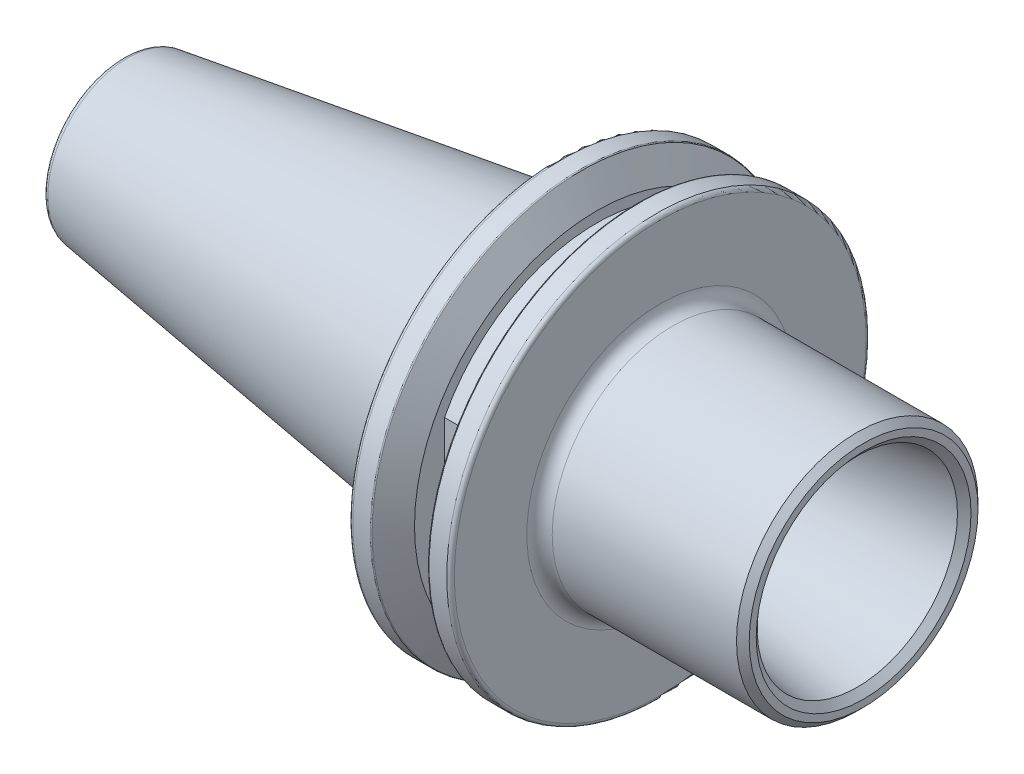
ISO-10303-21;
HEADER;
FILE_DESCRIPTION(('STEP AP214'),'2;1');
FILE_NAME('part.step','',(''),(''),'','','');
FILE_SCHEMA(('AUTOMOTIVE_DESIGN { 1 0 10303 214 1 1 1 1 }'));
ENDSEC;
DATA;
#1=APPLICATION_CONTEXT('core data for automotive mechanical design processes');
#2=APPLICATION_PROTOCOL_DEFINITION('international standard','automotive_design',2000,#1);
#3=PRODUCT_CONTEXT('',#1,'mechanical');
#4=PRODUCT('Part','Part','',(#3));
#5=PRODUCT_RELATED_PRODUCT_CATEGORY('part','',(#4));
#6=PRODUCT_DEFINITION_FORMATION('','',#4);
#7=PRODUCT_DEFINITION_CONTEXT('part definition',#1,'design');
#8=PRODUCT_DEFINITION('design','',#6,#7);
#9=PRODUCT_DEFINITION_SHAPE('','',#8);
#10=(LENGTH_UNIT() NAMED_UNIT(*) SI_UNIT(.MILLI.,.METRE.));
#11=(NAMED_UNIT(*) PLANE_ANGLE_UNIT() SI_UNIT($,.RADIAN.));
#12=(NAMED_UNIT(*) SI_UNIT($,.STERADIAN.) SOLID_ANGLE_UNIT());
#13=UNCERTAINTY_MEASURE_WITH_UNIT(LENGTH_MEASURE(1.E-05),#10,'distance_accuracy_value','');
#14=(GEOMETRIC_REPRESENTATION_CONTEXT(3) GLOBAL_UNCERTAINTY_ASSIGNED_CONTEXT((#13)) GLOBAL_UNIT_ASSIGNED_CONTEXT((#10,
#11,#12)) REPRESENTATION_CONTEXT('',''));
#15=CARTESIAN_POINT('',(0.,0.,0.));
#16=DIRECTION('',(0.,0.,1.));
#17=DIRECTION('',(1.,0.,0.));
#18=AXIS2_PLACEMENT_3D('',#15,#16,#17);
#19=CARTESIAN_POINT('',(-16.3,0.,0.));
#20=DIRECTION('',(1.,0.,0.));
#21=DIRECTION('',(0.,0.,-1.));
#22=AXIS2_PLACEMENT_3D('',#19,#20,#21);
#23=TOROIDAL_SURFACE('',#22,16.2,0.299999999999999);
#24=CARTESIAN_POINT('',(-16.,0.,0.));
#25=DIRECTION('',(-1.,0.,0.));
#26=DIRECTION('',(0.,1.,0.));
#27=AXIS2_PLACEMENT_3D('',#24,#25,#26);
#28=CIRCLE('',#27,16.2);
#29=CARTESIAN_POINT('',(-16.,16.2,0.));
#30=VERTEX_POINT('',#29);
#31=EDGE_CURVE('E131',#30,#30,#28,.F.);
#32=ORIENTED_EDGE('',*,*,#31,.F.);
#33=EDGE_LOOP('',(#32));
#34=FACE_BOUND('',#33,.T.);
#35=CARTESIAN_POINT('',(-16.3,0.,0.));
#36=DIRECTION('',(1.,0.,0.));
#37=DIRECTION('',(0.,0.,-1.));
#38=AXIS2_PLACEMENT_3D('',#35,#36,#37);
#39=CIRCLE('',#38,16.5);
#40=CARTESIAN_POINT('',(-16.3,0.,-16.5));
#41=VERTEX_POINT('',#40);
#42=EDGE_CURVE('E127',#41,#41,#39,.F.);
#43=ORIENTED_EDGE('',*,*,#42,.F.);
#44=EDGE_LOOP('',(#43));
#45=FACE_BOUND('',#44,.T.);
#46=ADVANCED_FACE('F17',(#34,#45),#23,.T.);
#47=CARTESIAN_POINT('',(-16.,10.5,0.));
#48=DIRECTION('',(1.,0.,0.));
#49=DIRECTION('',(0.,0.,-1.));
#50=AXIS2_PLACEMENT_3D('',#47,#48,#49);
#51=PLANE('',#50);
#52=CARTESIAN_POINT('',(-16.,0.,0.));
#53=DIRECTION('',(1.,0.,0.));
#54=DIRECTION('',(0.,1.,0.));
#55=AXIS2_PLACEMENT_3D('',#52,#53,#54);
#56=CIRCLE('',#55,10.5);
#57=CARTESIAN_POINT('',(-16.,10.5,0.));
#58=VERTEX_POINT('',#57);
#59=EDGE_CURVE('E130',#58,#58,#56,.F.);
#60=ORIENTED_EDGE('',*,*,#59,.T.);
#61=EDGE_LOOP('',(#60));
#62=FACE_BOUND('',#61,.T.);
#63=ORIENTED_EDGE('',*,*,#31,.T.);
#64=EDGE_LOOP('',(#63));
#65=FACE_BOUND('',#64,.T.);
#66=ADVANCED_FACE('F143',(#62,#65),#51,.T.);
#67=CARTESIAN_POINT('',(-16.9961324865405,0.,0.));
#68=DIRECTION('',(1.,0.,0.));
#69=DIRECTION('',(0.,0.,-1.));
#70=AXIS2_PLACEMENT_3D('',#67,#68,#69);
#71=CYLINDRICAL_SURFACE('',#70,16.5);
#72=ORIENTED_EDGE('',*,*,#42,.T.);
#73=EDGE_LOOP('',(#72));
#74=FACE_BOUND('',#73,.T.);
#75=CARTESIAN_POINT('',(-17.692264973081,0.,0.));
#76=DIRECTION('',(1.,0.,0.));
#77=DIRECTION('',(0.,0.,-1.));
#78=AXIS2_PLACEMENT_3D('',#75,#76,#77);
#79=CIRCLE('',#78,16.5);
#80=CARTESIAN_POINT('',(-17.692264973081,0.,-16.5));
#81=VERTEX_POINT('',#80);
#82=EDGE_CURVE('E102',#81,#81,#79,.F.);
#83=ORIENTED_EDGE('',*,*,#82,.F.);
#84=EDGE_LOOP('',(#83));
#85=FACE_BOUND('',#84,.T.);
#86=ADVANCED_FACE('F121',(#74,#85),#71,.T.);
#87=CARTESIAN_POINT('',(-15.,0.,0.));
#88=DIRECTION('',(1.,0.,0.));
#89=DIRECTION('',(0.,0.,-1.));
#90=AXIS2_PLACEMENT_3D('',#87,#88,#89);
#91=TOROIDAL_SURFACE('',#90,10.5,1.);
#92=CARTESIAN_POINT('',(-15.,0.,0.));
#93=DIRECTION('',(1.,0.,0.));
#94=DIRECTION('',(0.,0.,-1.));
#95=AXIS2_PLACEMENT_3D('',#92,#93,#94);
#96=CIRCLE('',#95,9.5);
#97=CARTESIAN_POINT('',(-15.,0.,-9.5));
#98=VERTEX_POINT('',#97);
#99=EDGE_CURVE('E97',#98,#98,#96,.T.);
#100=ORIENTED_EDGE('',*,*,#99,.F.);
#101=EDGE_LOOP('',(#100));
#102=FACE_BOUND('',#101,.T.);
#103=ORIENTED_EDGE('',*,*,#59,.F.);
#104=EDGE_LOOP('',(#103));
#105=FACE_BOUND('',#104,.T.);
#106=ADVANCED_FACE('F114',(#102,#105),#91,.F.);
#107=CARTESIAN_POINT('',(-17.692264973081,0.,0.));
#108=DIRECTION('',(1.,0.,0.));
#109=DIRECTION('',(0.,0.,-1.));
#110=AXIS2_PLACEMENT_3D('',#107,#108,#109);
#111=TOROIDAL_SURFACE('',#110,16.4,0.1);
#112=ORIENTED_EDGE('',*,*,#82,.T.);
#113=EDGE_LOOP('',(#112));
#114=FACE_BOUND('',#113,.T.);
#115=CARTESIAN_POINT('',(-17.7788675134631,0.,0.));
#116=DIRECTION('',(1.,0.,0.));
#117=DIRECTION('',(0.,1.,0.));
#118=AXIS2_PLACEMENT_3D('',#115,#116,#117);
#119=CIRCLE('',#118,16.4500000000021);
#120=CARTESIAN_POINT('',(-17.7788675134631,16.4500000000021,0.));
#121=VERTEX_POINT('',#120);
#122=EDGE_CURVE('E92',#121,#121,#119,.F.);
#123=ORIENTED_EDGE('',*,*,#122,.F.);
#124=EDGE_LOOP('',(#123));
#125=FACE_BOUND('',#124,.T.);
#126=ADVANCED_FACE('F109',(#114,#125),#111,.T.);
#127=CARTESIAN_POINT('',(-7.75,0.,0.));
#128=DIRECTION('',(1.,0.,0.));
#129=DIRECTION('',(0.,0.,-1.));
#130=AXIS2_PLACEMENT_3D('',#127,#128,#129);
#131=CYLINDRICAL_SURFACE('',#130,9.5);
#132=CARTESIAN_POINT('',(-0.499999999999362,0.,0.));
#133=DIRECTION('',(-1.,0.,0.));
#134=DIRECTION('',(0.,1.,0.));
#135=AXIS2_PLACEMENT_3D('',#132,#133,#134);
#136=CIRCLE('',#135,9.50000000000064);
#137=CARTESIAN_POINT('',(-0.499999999999361,9.50000000000064,0.));
#138=VERTEX_POINT('',#137);
#139=EDGE_CURVE('E88',#138,#138,#136,.F.);
#140=ORIENTED_EDGE('',*,*,#139,.F.);
#141=EDGE_LOOP('',(#140));
#142=FACE_BOUND('',#141,.T.);
#143=ORIENTED_EDGE('',*,*,#99,.T.);
#144=EDGE_LOOP('',(#143));
#145=FACE_BOUND('',#144,.T.);
#146=ADVANCED_FACE('F113',(#142,#145),#131,.T.);
#147=CARTESIAN_POINT('',(-17.7788675134631,0.,0.));
#148=DIRECTION('',(1.,0.,0.));
#149=DIRECTION('',(0.,0.,-1.));
#150=AXIS2_PLACEMENT_3D('',#147,#148,#149);
#151=CONICAL_SURFACE('',#150,16.4500000000021,1.0471975512);
#152=ORIENTED_EDGE('',*,*,#122,.T.);
#153=EDGE_LOOP('',(#152));
#154=FACE_BOUND('',#153,.T.);
#155=CARTESIAN_POINT('',(-18.9999999999964,0.,0.));
#156=DIRECTION('',(1.,0.,0.));
#157=DIRECTION('',(0.,0.,-1.));
#158=AXIS2_PLACEMENT_3D('',#155,#156,#157);
#159=CIRCLE('',#158,14.3349364905368);
#160=CARTESIAN_POINT('',(-18.9999999999964,0.,-14.3349364905368));
#161=VERTEX_POINT('',#160);
#162=EDGE_CURVE('E91',#161,#161,#159,.F.);
#163=ORIENTED_EDGE('',*,*,#162,.F.);
#164=EDGE_LOOP('',(#163));
#165=FACE_BOUND('',#164,.T.);
#166=ADVANCED_FACE('F229',(#154,#165),#151,.T.);
#167=CARTESIAN_POINT('',(-0.499999999999361,0.,0.));
#168=DIRECTION('',(-1.,0.,0.));
#169=DIRECTION('',(0.,0.,1.));
#170=AXIS2_PLACEMENT_3D('',#167,#168,#169);
#171=CONICAL_SURFACE('',#170,9.50000000000064,0.785398163400002);
#172=CARTESIAN_POINT('',(-6.39028760462956E-13,0.,0.));
#173=DIRECTION('',(-1.,0.,0.));
#174=DIRECTION('',(0.,0.,1.));
#175=AXIS2_PLACEMENT_3D('',#172,#173,#174);
#176=CIRCLE('',#175,8.99999999999936);
#177=CARTESIAN_POINT('',(-6.39028760462956E-13,0.,8.99999999999936));
#178=VERTEX_POINT('',#177);
#179=EDGE_CURVE('E68',#178,#178,#176,.F.);
#180=ORIENTED_EDGE('',*,*,#179,.F.);
#181=EDGE_LOOP('',(#180));
#182=FACE_BOUND('',#181,.T.);
#183=ORIENTED_EDGE('',*,*,#139,.T.);
#184=EDGE_LOOP('',(#183));
#185=FACE_BOUND('',#184,.T.);
#186=ADVANCED_FACE('F231',(#182,#185),#171,.T.);
#187=CARTESIAN_POINT('',(-19.,14.3349364905389,0.));
#188=DIRECTION('',(-1.,0.,0.));
#189=DIRECTION('',(0.,0.,1.));
#190=AXIS2_PLACEMENT_3D('',#187,#188,#189);
#191=PLANE('',#190);
#192=CARTESIAN_POINT('',(-19.,0.,0.));
#193=DIRECTION('',(1.,0.,0.));
#194=DIRECTION('',(0.,0.,-1.));
#195=AXIS2_PLACEMENT_3D('',#192,#193,#194);
#196=CIRCLE('',#195,13.5);
#197=CARTESIAN_POINT('',(-19.,6.23292668013992,11.975));
#198=VERTEX_POINT('',#197);
#199=CARTESIAN_POINT('',(-19.,6.23292668013992,-11.975));
#200=VERTEX_POINT('',#199);
#201=EDGE_CURVE('E58',#198,#200,#196,.F.);
#202=ORIENTED_EDGE('',*,*,#201,.F.);
#203=DIRECTION('',(0.,1.,0.));
#204=VECTOR('',#203,1.);
#205=CARTESIAN_POINT('',(-19.,-16.5,11.975));
#206=LINE('',#205,#204);
#207=CARTESIAN_POINT('',(-19.,-6.23292668013992,11.975));
#208=VERTEX_POINT('',#207);
#209=EDGE_CURVE('E64',#198,#208,#206,.F.);
#210=ORIENTED_EDGE('',*,*,#209,.T.);
#211=CARTESIAN_POINT('',(-19.,0.,0.));
#212=DIRECTION('',(1.,0.,0.));
#213=DIRECTION('',(0.,0.,-1.));
#214=AXIS2_PLACEMENT_3D('',#211,#212,#213);
#215=CIRCLE('',#214,13.5);
#216=CARTESIAN_POINT('',(-19.,-6.23292668013992,-11.975));
#217=VERTEX_POINT('',#216);
#218=EDGE_CURVE('E77',#217,#208,#215,.F.);
#219=ORIENTED_EDGE('',*,*,#218,.F.);
#220=DIRECTION('',(0.,1.,0.));
#221=VECTOR('',#220,1.);
#222=CARTESIAN_POINT('',(-19.,-16.5,-11.975));
#223=LINE('',#222,#221);
#224=EDGE_CURVE('E65',#217,#200,#223,.T.);
#225=ORIENTED_EDGE('',*,*,#224,.T.);
#226=EDGE_LOOP('',(#202,#210,#219,#225));
#227=FACE_BOUND('',#226,.T.);
#228=ORIENTED_EDGE('',*,*,#162,.T.);
#229=EDGE_LOOP('',(#228));
#230=FACE_BOUND('',#229,.T.);
#231=ADVANCED_FACE('F60',(#227,#230),#191,.T.);
#232=CARTESIAN_POINT('',(0.,8.45,0.));
#233=DIRECTION('',(1.,0.,0.));
#234=DIRECTION('',(0.,0.,-1.));
#235=AXIS2_PLACEMENT_3D('',#232,#233,#234);
#236=PLANE('',#235);
#237=CARTESIAN_POINT('',(-7.90112333198811E-13,0.,0.));
#238=DIRECTION('',(1.,0.,0.));
#239=DIRECTION('',(0.,0.,-1.));
#240=AXIS2_PLACEMENT_3D('',#237,#238,#239);
#241=CIRCLE('',#240,8.45000000000069);
#242=CARTESIAN_POINT('',(-7.90112333198811E-13,0.,-8.45000000000069));
#243=VERTEX_POINT('',#242);
#244=EDGE_CURVE('E81',#243,#243,#241,.F.);
#245=ORIENTED_EDGE('',*,*,#244,.T.);
#246=EDGE_LOOP('',(#245));
#247=FACE_BOUND('',#246,.T.);
#248=ORIENTED_EDGE('',*,*,#179,.T.);
#249=EDGE_LOOP('',(#248));
#250=FACE_BOUND('',#249,.T.);
#251=ADVANCED_FACE('F427',(#247,#250),#236,.T.);
#252=CARTESIAN_POINT('',(-20.,0.,0.));
#253=DIRECTION('',(1.,0.,0.));
#254=DIRECTION('',(0.,0.,-1.));
#255=AXIS2_PLACEMENT_3D('',#252,#253,#254);
#256=CYLINDRICAL_SURFACE('',#255,13.5);
#257=DIRECTION('',(1.,0.,0.));
#258=VECTOR('',#257,1.);
#259=CARTESIAN_POINT('',(-21.,6.23292668013992,-11.975));
#260=LINE('',#259,#258);
#261=CARTESIAN_POINT('',(-21.,6.23292668013992,-11.975));
#262=VERTEX_POINT('',#261);
#263=EDGE_CURVE('E85',#200,#262,#260,.F.);
#264=ORIENTED_EDGE('',*,*,#263,.T.);
#265=CARTESIAN_POINT('',(-21.,0.,0.));
#266=DIRECTION('',(1.,0.,0.));
#267=DIRECTION('',(0.,0.,-1.));
#268=AXIS2_PLACEMENT_3D('',#265,#266,#267);
#269=CIRCLE('',#268,13.5);
#270=CARTESIAN_POINT('',(-21.,6.23292668013992,11.975));
#271=VERTEX_POINT('',#270);
#272=EDGE_CURVE('E74',#271,#262,#269,.F.);
#273=ORIENTED_EDGE('',*,*,#272,.F.);
#274=DIRECTION('',(-1.,0.,0.));
#275=VECTOR('',#274,1.);
#276=CARTESIAN_POINT('',(-19.,6.23292668013992,11.975));
#277=LINE('',#276,#275);
#278=EDGE_CURVE('E71',#271,#198,#277,.F.);
#279=ORIENTED_EDGE('',*,*,#278,.T.);
#280=ORIENTED_EDGE('',*,*,#201,.T.);
#281=EDGE_LOOP('',(#264,#273,#279,#280));
#282=FACE_BOUND('',#281,.T.);
#283=ADVANCED_FACE('F72',(#282),#256,.T.);
#284=CARTESIAN_POINT('',(-21.,-16.5,-11.975));
#285=DIRECTION('',(0.,0.,1.));
#286=DIRECTION('',(1.,0.,0.));
#287=AXIS2_PLACEMENT_3D('',#284,#285,#286);
#288=PLANE('',#287);
#289=DIRECTION('',(0.,1.,0.));
#290=VECTOR('',#289,1.);
#291=CARTESIAN_POINT('',(-21.,13.5,-11.975));
#292=LINE('',#291,#290);
#293=CARTESIAN_POINT('',(-21.,-6.23292668013992,-11.975));
#294=VERTEX_POINT('',#293);
#295=EDGE_CURVE('E215',#262,#294,#292,.F.);
#296=ORIENTED_EDGE('',*,*,#295,.F.);
#297=ORIENTED_EDGE('',*,*,#263,.F.);
#298=ORIENTED_EDGE('',*,*,#224,.F.);
#299=DIRECTION('',(1.,0.,0.));
#300=VECTOR('',#299,1.);
#301=CARTESIAN_POINT('',(-20.,-6.23292668013992,-11.975));
#302=LINE('',#301,#300);
#303=EDGE_CURVE('E221',#294,#217,#302,.T.);
#304=ORIENTED_EDGE('',*,*,#303,.F.);
#305=EDGE_LOOP('',(#296,#297,#298,#304));
#306=FACE_BOUND('',#305,.T.);
#307=ADVANCED_FACE('F421',(#306),#288,.F.);
#308=CARTESIAN_POINT('',(-20.,0.,0.));
#309=DIRECTION('',(1.,0.,0.));
#310=DIRECTION('',(0.,0.,-1.));
#311=AXIS2_PLACEMENT_3D('',#308,#309,#310);
#312=CYLINDRICAL_SURFACE('',#311,13.5);
#313=ORIENTED_EDGE('',*,*,#303,.T.);
#314=ORIENTED_EDGE('',*,*,#218,.T.);
#315=DIRECTION('',(-1.,0.,0.));
#316=VECTOR('',#315,1.);
#317=CARTESIAN_POINT('',(-19.,-6.23292668013992,11.975));
#318=LINE('',#317,#316);
#319=CARTESIAN_POINT('',(-21.,-6.23292668013992,11.975));
#320=VERTEX_POINT('',#319);
#321=EDGE_CURVE('E37',#208,#320,#318,.T.);
#322=ORIENTED_EDGE('',*,*,#321,.T.);
#323=CARTESIAN_POINT('',(-21.,0.,0.));
#324=DIRECTION('',(1.,0.,0.));
#325=DIRECTION('',(0.,0.,-1.));
#326=AXIS2_PLACEMENT_3D('',#323,#324,#325);
#327=CIRCLE('',#326,13.5);
#328=EDGE_CURVE('E211',#294,#320,#327,.F.);
#329=ORIENTED_EDGE('',*,*,#328,.F.);
#330=EDGE_LOOP('',(#313,#314,#322,#329));
#331=FACE_BOUND('',#330,.T.);
#332=ADVANCED_FACE('F418',(#331),#312,.T.);
#333=CARTESIAN_POINT('',(-19.,-16.5,11.975));
#334=DIRECTION('',(0.,0.,-1.));
#335=DIRECTION('',(-1.,0.,0.));
#336=AXIS2_PLACEMENT_3D('',#333,#334,#335);
#337=PLANE('',#336);
#338=ORIENTED_EDGE('',*,*,#209,.F.);
#339=ORIENTED_EDGE('',*,*,#278,.F.);
#340=DIRECTION('',(0.,1.,0.));
#341=VECTOR('',#340,1.);
#342=CARTESIAN_POINT('',(-21.,13.5,11.975));
#343=LINE('',#342,#341);
#344=EDGE_CURVE('E214',#320,#271,#343,.T.);
#345=ORIENTED_EDGE('',*,*,#344,.F.);
#346=ORIENTED_EDGE('',*,*,#321,.F.);
#347=EDGE_LOOP('',(#338,#339,#345,#346));
#348=FACE_BOUND('',#347,.T.);
#349=ADVANCED_FACE('F79',(#348),#337,.F.);
#350=CARTESIAN_POINT('',(-7.90112333198811E-13,0.,0.));
#351=DIRECTION('',(1.,0.,0.));
#352=DIRECTION('',(0.,0.,-1.));
#353=AXIS2_PLACEMENT_3D('',#350,#351,#352);
#354=CONICAL_SURFACE('',#353,8.45000000000069,0.855211333480002);
#355=CARTESIAN_POINT('',(-0.495134034395051,0.,0.));
#356=DIRECTION('',(1.,0.,0.));
#357=DIRECTION('',(0.,1.,0.));
#358=AXIS2_PLACEMENT_3D('',#355,#356,#357);
#359=CIRCLE('',#358,7.88041344952717);
#360=CARTESIAN_POINT('',(-0.495134034395051,7.88041344952717,0.));
#361=VERTEX_POINT('',#360);
#362=EDGE_CURVE('E208',#361,#361,#359,.F.);
#363=ORIENTED_EDGE('',*,*,#362,.T.);
#364=EDGE_LOOP('',(#363));
#365=FACE_BOUND('',#364,.T.);
#366=ORIENTED_EDGE('',*,*,#244,.F.);
#367=EDGE_LOOP('',(#366));
#368=FACE_BOUND('',#367,.T.);
#369=ADVANCED_FACE('F411',(#365,#368),#354,.F.);
#370=CARTESIAN_POINT('',(-21.,13.5,0.));
#371=DIRECTION('',(1.,0.,0.));
#372=DIRECTION('',(0.,0.,-1.));
#373=AXIS2_PLACEMENT_3D('',#370,#371,#372);
#374=PLANE('',#373);
#375=ORIENTED_EDGE('',*,*,#328,.T.);
#376=ORIENTED_EDGE('',*,*,#344,.T.);
#377=ORIENTED_EDGE('',*,*,#272,.T.);
#378=ORIENTED_EDGE('',*,*,#295,.T.);
#379=EDGE_LOOP('',(#375,#376,#377,#378));
#380=FACE_BOUND('',#379,.T.);
#381=CARTESIAN_POINT('',(-21.0000000000036,0.,0.));
#382=DIRECTION('',(-1.,0.,0.));
#383=DIRECTION('',(0.,0.,1.));
#384=AXIS2_PLACEMENT_3D('',#381,#382,#383);
#385=CIRCLE('',#384,14.3349364905368);
#386=CARTESIAN_POINT('',(-21.0000000000036,0.,14.3349364905368));
#387=VERTEX_POINT('',#386);
#388=EDGE_CURVE('E204',#387,#387,#385,.T.);
#389=ORIENTED_EDGE('',*,*,#388,.F.);
#390=EDGE_LOOP('',(#389));
#391=FACE_BOUND('',#390,.T.);
#392=ADVANCED_FACE('F407',(#380,#391),#374,.T.);
#393=CARTESIAN_POINT('',(-0.495134034565581,0.,0.));
#394=DIRECTION('',(1.,0.,0.));
#395=DIRECTION('',(0.,0.,-1.));
#396=AXIS2_PLACEMENT_3D('',#393,#394,#395);
#397=CONICAL_SURFACE('',#396,7.88041344949875,0.139626340159756);
#398=CARTESIAN_POINT('',(-14.0172783530969,0.,0.));
#399=DIRECTION('',(1.,0.,0.));
#400=DIRECTION('',(0.,0.,-1.));
#401=AXIS2_PLACEMENT_3D('',#398,#399,#400);
#402=CIRCLE('',#401,5.98);
#403=CARTESIAN_POINT('',(-14.0172783530969,0.,-5.98));
#404=VERTEX_POINT('',#403);
#405=EDGE_CURVE('E207',#404,#404,#402,.F.);
#406=ORIENTED_EDGE('',*,*,#405,.T.);
#407=EDGE_LOOP('',(#406));
#408=FACE_BOUND('',#407,.T.);
#409=ORIENTED_EDGE('',*,*,#362,.F.);
#410=EDGE_LOOP('',(#409));
#411=FACE_BOUND('',#410,.T.);
#412=ADVANCED_FACE('F403',(#408,#411),#397,.F.);
#413=CARTESIAN_POINT('',(-22.2211324865369,0.,0.));
#414=DIRECTION('',(-1.,0.,0.));
#415=DIRECTION('',(0.,0.,1.));
#416=AXIS2_PLACEMENT_3D('',#413,#414,#415);
#417=CONICAL_SURFACE('',#416,16.4500000000021,1.0471975512);
#418=ORIENTED_EDGE('',*,*,#388,.T.);
#419=EDGE_LOOP('',(#418));
#420=FACE_BOUND('',#419,.T.);
#421=CARTESIAN_POINT('',(-22.2211324865405,0.,0.));
#422=DIRECTION('',(1.,0.,0.));
#423=DIRECTION('',(0.,0.,-1.));
#424=AXIS2_PLACEMENT_3D('',#421,#422,#423);
#425=CIRCLE('',#424,16.45);
#426=CARTESIAN_POINT('',(-22.2211324865405,0.,-16.45));
#427=VERTEX_POINT('',#426);
#428=EDGE_CURVE('E201',#427,#427,#425,.F.);
#429=ORIENTED_EDGE('',*,*,#428,.F.);
#430=EDGE_LOOP('',(#429));
#431=FACE_BOUND('',#430,.T.);
#432=ADVANCED_FACE('F399',(#420,#431),#417,.T.);
#433=CARTESIAN_POINT('',(-21.2586391765484,0.,0.));
#434=DIRECTION('',(1.,0.,0.));
#435=DIRECTION('',(0.,0.,-1.));
#436=AXIS2_PLACEMENT_3D('',#433,#434,#435);
#437=CYLINDRICAL_SURFACE('',#436,5.98);
#438=CARTESIAN_POINT('',(-28.5,0.,0.));
#439=DIRECTION('',(1.,0.,0.));
#440=DIRECTION('',(0.,0.,-1.));
#441=AXIS2_PLACEMENT_3D('',#438,#439,#440);
#442=CIRCLE('',#441,5.98);
#443=CARTESIAN_POINT('',(-28.5,0.,-5.98));
#444=VERTEX_POINT('',#443);
#445=EDGE_CURVE('E198',#444,#444,#442,.T.);
#446=ORIENTED_EDGE('',*,*,#445,.F.);
#447=EDGE_LOOP('',(#446));
#448=FACE_BOUND('',#447,.T.);
#449=ORIENTED_EDGE('',*,*,#405,.F.);
#450=EDGE_LOOP('',(#449));
#451=FACE_BOUND('',#450,.T.);
#452=ADVANCED_FACE('F395',(#448,#451),#437,.F.);
#453=CARTESIAN_POINT('',(-22.307735026919,0.,0.));
#454=DIRECTION('',(1.,0.,0.));
#455=DIRECTION('',(0.,0.,-1.));
#456=AXIS2_PLACEMENT_3D('',#453,#454,#455);
#457=TOROIDAL_SURFACE('',#456,16.4,0.1);
#458=ORIENTED_EDGE('',*,*,#428,.T.);
#459=EDGE_LOOP('',(#458));
#460=FACE_BOUND('',#459,.T.);
#461=CARTESIAN_POINT('',(-22.307735026919,0.,0.));
#462=DIRECTION('',(1.,0.,0.));
#463=DIRECTION('',(0.,0.,-1.));
#464=AXIS2_PLACEMENT_3D('',#461,#462,#463);
#465=CIRCLE('',#464,16.5);
#466=CARTESIAN_POINT('',(-22.307735026919,0.,-16.5));
#467=VERTEX_POINT('',#466);
#468=EDGE_CURVE('E195',#467,#467,#465,.F.);
#469=ORIENTED_EDGE('',*,*,#468,.F.);
#470=EDGE_LOOP('',(#469));
#471=FACE_BOUND('',#470,.T.);
#472=ADVANCED_FACE('F390',(#460,#471),#457,.T.);
#473=CARTESIAN_POINT('',(-28.5,0.,0.));
#474=DIRECTION('',(1.,0.,0.));
#475=DIRECTION('',(0.,0.,-1.));
#476=AXIS2_PLACEMENT_3D('',#473,#474,#475);
#477=PLANE('',#476);
#478=CARTESIAN_POINT('',(-28.5,0.,0.));
#479=DIRECTION('',(-1.,0.,0.));
#480=DIRECTION('',(0.,0.,1.));
#481=AXIS2_PLACEMENT_3D('',#478,#479,#480);
#482=CIRCLE('',#481,3.3235);
#483=CARTESIAN_POINT('',(-28.5,0.,3.3235));
#484=VERTEX_POINT('',#483);
#485=EDGE_CURVE('E191',#484,#484,#482,.T.);
#486=ORIENTED_EDGE('',*,*,#485,.T.);
#487=EDGE_LOOP('',(#486));
#488=FACE_BOUND('',#487,.T.);
#489=ORIENTED_EDGE('',*,*,#445,.T.);
#490=EDGE_LOOP('',(#489));
#491=FACE_BOUND('',#490,.T.);
#492=ADVANCED_FACE('F394',(#488,#491),#477,.T.);
#493=CARTESIAN_POINT('',(-23.0038675134595,0.,0.));
#494=DIRECTION('',(1.,0.,0.));
#495=DIRECTION('',(0.,0.,-1.));
#496=AXIS2_PLACEMENT_3D('',#493,#494,#495);
#497=CYLINDRICAL_SURFACE('',#496,16.5);
#498=ORIENTED_EDGE('',*,*,#468,.T.);
#499=EDGE_LOOP('',(#498));
#500=FACE_BOUND('',#499,.T.);
#501=CARTESIAN_POINT('',(-23.7,0.,0.));
#502=DIRECTION('',(1.,0.,0.));
#503=DIRECTION('',(0.,0.,-1.));
#504=AXIS2_PLACEMENT_3D('',#501,#502,#503);
#505=CIRCLE('',#504,16.5);
#506=CARTESIAN_POINT('',(-23.7,0.,-16.5));
#507=VERTEX_POINT('',#506);
#508=EDGE_CURVE('E194',#507,#507,#505,.F.);
#509=ORIENTED_EDGE('',*,*,#508,.F.);
#510=EDGE_LOOP('',(#509));
#511=FACE_BOUND('',#510,.T.);
#512=ADVANCED_FACE('F488',(#500,#511),#497,.T.);
#513=CARTESIAN_POINT('',(18.8785779189722,0.,0.));
#514=DIRECTION('',(-1.,0.,0.));
#515=DIRECTION('',(0.,0.,1.));
#516=AXIS2_PLACEMENT_3D('',#513,#514,#515);
#517=CYLINDRICAL_SURFACE('',#516,3.3235);
#518=CARTESIAN_POINT('',(-54.8734999999851,0.,0.));
#519=DIRECTION('',(-1.,0.,0.));
#520=DIRECTION('',(0.,0.,1.));
#521=AXIS2_PLACEMENT_3D('',#518,#519,#520);
#522=CIRCLE('',#521,3.32349999996495);
#523=CARTESIAN_POINT('',(-54.8734999999851,0.,3.32349999996495));
#524=VERTEX_POINT('',#523);
#525=EDGE_CURVE('E347',#524,#524,#522,.T.);
#526=ORIENTED_EDGE('',*,*,#525,.T.);
#527=EDGE_LOOP('',(#526));
#528=FACE_BOUND('',#527,.T.);
#529=ORIENTED_EDGE('',*,*,#485,.F.);
#530=EDGE_LOOP('',(#529));
#531=FACE_BOUND('',#530,.T.);
#532=ADVANCED_FACE('F368',(#528,#531),#517,.F.);
#533=CARTESIAN_POINT('',(-23.7,0.,0.));
#534=DIRECTION('',(1.,0.,0.));
#535=DIRECTION('',(0.,0.,-1.));
#536=AXIS2_PLACEMENT_3D('',#533,#534,#535);
#537=TOROIDAL_SURFACE('',#536,16.2,0.3);
#538=ORIENTED_EDGE('',*,*,#508,.T.);
#539=EDGE_LOOP('',(#538));
#540=FACE_BOUND('',#539,.T.);
#541=CARTESIAN_POINT('',(-24.,0.,0.));
#542=DIRECTION('',(1.,0.,0.));
#543=DIRECTION('',(0.,1.,0.));
#544=AXIS2_PLACEMENT_3D('',#541,#542,#543);
#545=CIRCLE('',#544,16.2);
#546=CARTESIAN_POINT('',(-24.,16.2,0.));
#547=VERTEX_POINT('',#546);
#548=EDGE_CURVE('E355',#547,#547,#545,.F.);
#549=ORIENTED_EDGE('',*,*,#548,.F.);
#550=EDGE_LOOP('',(#549));
#551=FACE_BOUND('',#550,.T.);
#552=ADVANCED_FACE('F362',(#540,#551),#537,.T.);
#553=CARTESIAN_POINT('',(-55.7999999999197,0.,0.));
#554=DIRECTION('',(-1.,0.,0.));
#555=DIRECTION('',(0.,-1.,0.));
#556=AXIS2_PLACEMENT_3D('',#553,#554,#555);
#557=CONICAL_SURFACE('',#556,4.24999999995634,0.785398163397448);
#558=ORIENTED_EDGE('',*,*,#525,.F.);
#559=EDGE_LOOP('',(#558));
#560=FACE_BOUND('',#559,.T.);
#561=CARTESIAN_POINT('',(-55.8,0.,0.));
#562=DIRECTION('',(1.,0.,0.));
#563=DIRECTION('',(0.,0.,-1.));
#564=AXIS2_PLACEMENT_3D('',#561,#562,#563);
#565=CIRCLE('',#564,4.25);
#566=CARTESIAN_POINT('',(-55.8,0.,-4.25));
#567=VERTEX_POINT('',#566);
#568=EDGE_CURVE('E328',#567,#567,#565,.F.);
#569=ORIENTED_EDGE('',*,*,#568,.T.);
#570=EDGE_LOOP('',(#569));
#571=FACE_BOUND('',#570,.T.);
#572=ADVANCED_FACE('F367',(#560,#571),#557,.F.);
#573=CARTESIAN_POINT('',(-24.,16.2,0.));
#574=DIRECTION('',(-1.,0.,0.));
#575=DIRECTION('',(0.,0.,1.));
#576=AXIS2_PLACEMENT_3D('',#573,#574,#575);
#577=PLANE('',#576);
#578=CARTESIAN_POINT('',(-24.,0.,0.));
#579=DIRECTION('',(-1.,0.,0.));
#580=DIRECTION('',(0.,1.,0.));
#581=AXIS2_PLACEMENT_3D('',#578,#579,#580);
#582=CIRCLE('',#581,11.03);
#583=CARTESIAN_POINT('',(-24.,11.03,0.));
#584=VERTEX_POINT('',#583);
#585=EDGE_CURVE('E323',#584,#584,#582,.F.);
#586=ORIENTED_EDGE('',*,*,#585,.T.);
#587=EDGE_LOOP('',(#586));
#588=FACE_BOUND('',#587,.T.);
#589=ORIENTED_EDGE('',*,*,#548,.T.);
#590=EDGE_LOOP('',(#589));
#591=FACE_BOUND('',#590,.T.);
#592=ADVANCED_FACE('F511',(#588,#591),#577,.T.);
#593=CARTESIAN_POINT('',(-58.3,0.,0.));
#594=DIRECTION('',(1.,0.,0.));
#595=DIRECTION('',(0.,0.,-1.));
#596=AXIS2_PLACEMENT_3D('',#593,#594,#595);
#597=CYLINDRICAL_SURFACE('',#596,4.25);
#598=CARTESIAN_POINT('',(-58.0999999999676,0.,0.));
#599=DIRECTION('',(-1.,0.,0.));
#600=DIRECTION('',(0.,0.,-1.));
#601=AXIS2_PLACEMENT_3D('',#598,#599,#600);
#602=CIRCLE('',#601,4.25000000001319);
#603=CARTESIAN_POINT('',(-58.0999999999676,0.,-4.25000000001319));
#604=VERTEX_POINT('',#603);
#605=EDGE_CURVE('E318',#604,#604,#602,.T.);
#606=ORIENTED_EDGE('',*,*,#605,.T.);
#607=EDGE_LOOP('',(#606));
#608=FACE_BOUND('',#607,.T.);
#609=ORIENTED_EDGE('',*,*,#568,.F.);
#610=EDGE_LOOP('',(#609));
#611=FACE_BOUND('',#610,.T.);
#612=ADVANCED_FACE('F337',(#608,#611),#597,.F.);
#613=CARTESIAN_POINT('',(-24.1,0.,0.));
#614=DIRECTION('',(1.,0.,0.));
#615=DIRECTION('',(0.,0.,-1.));
#616=AXIS2_PLACEMENT_3D('',#613,#614,#615);
#617=TOROIDAL_SURFACE('',#616,11.03,0.1);
#618=ORIENTED_EDGE('',*,*,#585,.F.);
#619=EDGE_LOOP('',(#618));
#620=FACE_BOUND('',#619,.T.);
#621=CARTESIAN_POINT('',(-24.1,0.,0.));
#622=DIRECTION('',(1.,0.,0.));
#623=DIRECTION('',(0.,0.,-1.));
#624=AXIS2_PLACEMENT_3D('',#621,#622,#623);
#625=CIRCLE('',#624,10.93);
#626=CARTESIAN_POINT('',(-24.1,0.,-10.93));
#627=VERTEX_POINT('',#626);
#628=EDGE_CURVE('E188',#627,#627,#625,.F.);
#629=ORIENTED_EDGE('',*,*,#628,.F.);
#630=EDGE_LOOP('',(#629));
#631=FACE_BOUND('',#630,.T.);
#632=ADVANCED_FACE('F331',(#620,#631),#617,.F.);
#633=CARTESIAN_POINT('',(-58.2999999998606,0.,0.));
#634=DIRECTION('',(-1.,0.,0.));
#635=DIRECTION('',(0.,0.,1.));
#636=AXIS2_PLACEMENT_3D('',#633,#634,#635);
#637=CONICAL_SURFACE('',#636,4.44999999990614,0.785398163539557);
#638=CARTESIAN_POINT('',(-58.2999999999174,0.,0.));
#639=DIRECTION('',(-1.,0.,0.));
#640=DIRECTION('',(0.,0.,1.));
#641=AXIS2_PLACEMENT_3D('',#638,#639,#640);
#642=CIRCLE('',#641,4.44999999996298);
#643=CARTESIAN_POINT('',(-58.2999999999174,0.,4.44999999996298));
#644=VERTEX_POINT('',#643);
#645=EDGE_CURVE('E184',#644,#644,#642,.F.);
#646=ORIENTED_EDGE('',*,*,#645,.F.);
#647=EDGE_LOOP('',(#646));
#648=FACE_BOUND('',#647,.T.);
#649=ORIENTED_EDGE('',*,*,#605,.F.);
#650=EDGE_LOOP('',(#649));
#651=FACE_BOUND('',#650,.T.);
#652=ADVANCED_FACE('F336',(#648,#651),#637,.F.);
#653=CARTESIAN_POINT('',(-24.5,0.,0.));
#654=DIRECTION('',(1.,0.,0.));
#655=DIRECTION('',(0.,0.,-1.));
#656=AXIS2_PLACEMENT_3D('',#653,#654,#655);
#657=CYLINDRICAL_SURFACE('',#656,10.93);
#658=ORIENTED_EDGE('',*,*,#628,.T.);
#659=EDGE_LOOP('',(#658));
#660=FACE_BOUND('',#659,.T.);
#661=CARTESIAN_POINT('',(-24.9,0.,0.));
#662=DIRECTION('',(1.,0.,0.));
#663=DIRECTION('',(0.,0.,-1.));
#664=AXIS2_PLACEMENT_3D('',#661,#662,#663);
#665=CIRCLE('',#664,10.93);
#666=CARTESIAN_POINT('',(-24.9,0.,-10.93));
#667=VERTEX_POINT('',#666);
#668=EDGE_CURVE('E187',#667,#667,#665,.T.);
#669=ORIENTED_EDGE('',*,*,#668,.T.);
#670=EDGE_LOOP('',(#669));
#671=FACE_BOUND('',#670,.T.);
#672=ADVANCED_FACE('F534',(#660,#671),#657,.T.);
#673=CARTESIAN_POINT('',(-58.3,5.82383383615974,0.));
#674=DIRECTION('',(-1.,0.,0.));
#675=DIRECTION('',(0.,0.,1.));
#676=AXIS2_PLACEMENT_3D('',#673,#674,#675);
#677=PLANE('',#676);
#678=ORIENTED_EDGE('',*,*,#645,.T.);
#679=EDGE_LOOP('',(#678));
#680=FACE_BOUND('',#679,.T.);
#681=CARTESIAN_POINT('',(-58.3,0.,0.));
#682=DIRECTION('',(1.,0.,0.));
#683=DIRECTION('',(0.,1.,0.));
#684=AXIS2_PLACEMENT_3D('',#681,#682,#683);
#685=CIRCLE('',#684,5.82383383615974);
#686=CARTESIAN_POINT('',(-58.3,5.82383383615974,0.));
#687=VERTEX_POINT('',#686);
#688=EDGE_CURVE('E297',#687,#687,#685,.T.);
#689=ORIENTED_EDGE('',*,*,#688,.F.);
#690=EDGE_LOOP('',(#689));
#691=FACE_BOUND('',#690,.T.);
#692=ADVANCED_FACE('F278',(#680,#691),#677,.T.);
#693=CARTESIAN_POINT('',(-24.9,0.,0.));
#694=DIRECTION('',(1.,0.,0.));
#695=DIRECTION('',(0.,0.,-1.));
#696=AXIS2_PLACEMENT_3D('',#693,#694,#695);
#697=TOROIDAL_SURFACE('',#696,11.03,0.1);
#698=ORIENTED_EDGE('',*,*,#668,.F.);
#699=EDGE_LOOP('',(#698));
#700=FACE_BOUND('',#699,.T.);
#701=CARTESIAN_POINT('',(-25.,0.,0.));
#702=DIRECTION('',(1.,0.,0.));
#703=DIRECTION('',(0.,1.,0.));
#704=AXIS2_PLACEMENT_3D('',#701,#702,#703);
#705=CIRCLE('',#704,11.03);
#706=CARTESIAN_POINT('',(-25.,11.03,0.));
#707=VERTEX_POINT('',#706);
#708=EDGE_CURVE('E680',#707,#707,#705,.F.);
#709=ORIENTED_EDGE('',*,*,#708,.F.);
#710=EDGE_LOOP('',(#709));
#711=FACE_BOUND('',#710,.T.);
#712=ADVANCED_FACE('F274',(#700,#711),#697,.F.);
#713=CARTESIAN_POINT('',(-57.8,0.,0.));
#714=DIRECTION('',(1.,0.,0.));
#715=DIRECTION('',(0.,0.,-1.));
#716=AXIS2_PLACEMENT_3D('',#713,#714,#715);
#717=TOROIDAL_SURFACE('',#716,5.82383383615974,0.500000000000003);
#718=CARTESIAN_POINT('',(-57.872154094443,0.,0.));
#719=DIRECTION('',(1.,0.,0.));
#720=DIRECTION('',(0.,1.,0.));
#721=AXIS2_PLACEMENT_3D('',#718,#719,#720);
#722=CIRCLE('',#721,6.31860023219661);
#723=CARTESIAN_POINT('',(-57.872154094443,6.31860023219661,0.));
#724=VERTEX_POINT('',#723);
#725=EDGE_CURVE('E28',#724,#724,#722,.T.);
#726=ORIENTED_EDGE('',*,*,#725,.F.);
#727=EDGE_LOOP('',(#726));
#728=FACE_BOUND('',#727,.T.);
#729=ORIENTED_EDGE('',*,*,#688,.T.);
#730=EDGE_LOOP('',(#729));
#731=FACE_BOUND('',#730,.T.);
#732=ADVANCED_FACE('F249',(#728,#731),#717,.T.);
#733=CARTESIAN_POINT('',(-25.,11.03,0.));
#734=DIRECTION('',(1.,0.,0.));
#735=DIRECTION('',(0.,0.,-1.));
#736=AXIS2_PLACEMENT_3D('',#733,#734,#735);
#737=PLANE('',#736);
#738=ORIENTED_EDGE('',*,*,#708,.T.);
#739=EDGE_LOOP('',(#738));
#740=FACE_BOUND('',#739,.T.);
#741=CARTESIAN_POINT('',(-25.0000000000011,0.,0.));
#742=DIRECTION('',(1.,0.,0.));
#743=DIRECTION('',(0.,0.,-1.));
#744=AXIS2_PLACEMENT_3D('',#741,#742,#743);
#745=CIRCLE('',#744,11.1125000000077);
#746=CARTESIAN_POINT('',(-25.0000000000011,0.,-11.1125000000077));
#747=VERTEX_POINT('',#746);
#748=EDGE_CURVE('E11',#747,#747,#745,.F.);
#749=ORIENTED_EDGE('',*,*,#748,.F.);
#750=EDGE_LOOP('',(#749));
#751=FACE_BOUND('',#750,.T.);
#752=ADVANCED_FACE('F243',(#740,#751),#737,.T.);
#753=CARTESIAN_POINT('',(-25.0000000000011,0.,0.));
#754=DIRECTION('',(1.,0.,0.));
#755=DIRECTION('',(0.,0.,-1.));
#756=AXIS2_PLACEMENT_3D('',#753,#754,#755);
#757=CONICAL_SURFACE('',#756,11.1125000000077,0.144813807762795);
#758=ORIENTED_EDGE('',*,*,#748,.T.);
#759=EDGE_LOOP('',(#758));
#760=FACE_BOUND('',#759,.T.);
#761=ORIENTED_EDGE('',*,*,#725,.T.);
#762=EDGE_LOOP('',(#761));
#763=FACE_BOUND('',#762,.T.);
#764=ADVANCED_FACE('F241',(#760,#763),#757,.T.);
#765=CLOSED_SHELL('',(#46,#66,#86,#106,#126,#146,#166,#186,#231,#251,#283,#307,#332,#349,#369,
#392,#412,#432,#452,#472,#492,#512,#532,#552,#572,#592,#612,#632,#652,#672,#692,#712,#732,#752,#764));
#766=MANIFOLD_SOLID_BREP('B1',#765);
#767=ADVANCED_BREP_SHAPE_REPRESENTATION('',(#18,#766),#14);
#768=SHAPE_DEFINITION_REPRESENTATION(#9,#767);
ENDSEC;
END-ISO-10303-21;
